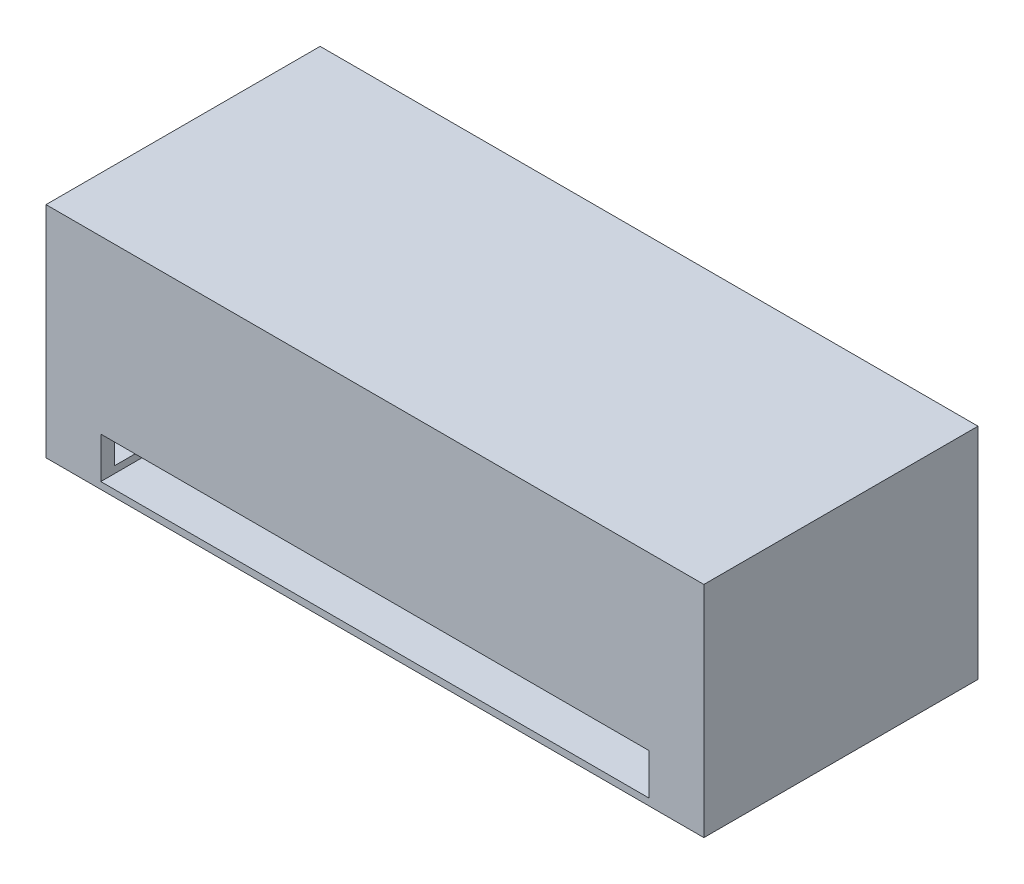
ISO-10303-21;
HEADER;
FILE_DESCRIPTION(('STEP AP214'),'2;1');
FILE_NAME('part.step','',(''),(''),'','','');
FILE_SCHEMA(('AUTOMOTIVE_DESIGN { 1 0 10303 214 1 1 1 1 }'));
ENDSEC;
DATA;
#1=APPLICATION_CONTEXT('core data for automotive mechanical design processes');
#2=APPLICATION_PROTOCOL_DEFINITION('international standard','automotive_design',2000,#1);
#3=PRODUCT_CONTEXT('',#1,'mechanical');
#4=PRODUCT('Part','Part','',(#3));
#5=PRODUCT_RELATED_PRODUCT_CATEGORY('part','',(#4));
#6=PRODUCT_DEFINITION_FORMATION('','',#4);
#7=PRODUCT_DEFINITION_CONTEXT('part definition',#1,'design');
#8=PRODUCT_DEFINITION('design','',#6,#7);
#9=PRODUCT_DEFINITION_SHAPE('','',#8);
#10=(LENGTH_UNIT() NAMED_UNIT(*) SI_UNIT(.MILLI.,.METRE.));
#11=(NAMED_UNIT(*) PLANE_ANGLE_UNIT() SI_UNIT($,.RADIAN.));
#12=(NAMED_UNIT(*) SI_UNIT($,.STERADIAN.) SOLID_ANGLE_UNIT());
#13=UNCERTAINTY_MEASURE_WITH_UNIT(LENGTH_MEASURE(1.E-05),#10,'distance_accuracy_value','');
#14=(GEOMETRIC_REPRESENTATION_CONTEXT(3) GLOBAL_UNCERTAINTY_ASSIGNED_CONTEXT((#13)) GLOBAL_UNIT_ASSIGNED_CONTEXT((#10,
#11,#12)) REPRESENTATION_CONTEXT('',''));
#15=CARTESIAN_POINT('',(0.,0.,0.));
#16=DIRECTION('',(0.,0.,1.));
#17=DIRECTION('',(1.,0.,0.));
#18=AXIS2_PLACEMENT_3D('',#15,#16,#17);
#19=CARTESIAN_POINT('',(0.,6.35,0.));
#20=DIRECTION('',(0.,-1.,0.));
#21=DIRECTION('',(0.,0.,-1.));
#22=AXIS2_PLACEMENT_3D('',#19,#20,#21);
#23=PLANE('',#22);
#24=DIRECTION('',(-1.,0.,0.));
#25=VECTOR('',#24,1.);
#26=CARTESIAN_POINT('',(0.,6.35,-57.15));
#27=LINE('',#26,#25);
#28=CARTESIAN_POINT('',(146.05,6.35,-57.15));
#29=VERTEX_POINT('',#28);
#30=CARTESIAN_POINT('',(127.,6.35,-57.15));
#31=VERTEX_POINT('',#30);
#32=EDGE_CURVE('E256',#29,#31,#27,.T.);
#33=ORIENTED_EDGE('',*,*,#32,.T.);
#34=DIRECTION('',(0.,0.,1.));
#35=VECTOR('',#34,1.);
#36=CARTESIAN_POINT('',(127.,6.35,0.));
#37=LINE('',#36,#35);
#38=CARTESIAN_POINT('',(127.,6.35,57.15));
#39=VERTEX_POINT('',#38);
#40=EDGE_CURVE('E267',#31,#39,#37,.T.);
#41=ORIENTED_EDGE('',*,*,#40,.T.);
#42=DIRECTION('',(1.,0.,0.));
#43=VECTOR('',#42,1.);
#44=CARTESIAN_POINT('',(0.,6.35,57.15));
#45=LINE('',#44,#43);
#46=CARTESIAN_POINT('',(146.05,6.35,57.15));
#47=VERTEX_POINT('',#46);
#48=EDGE_CURVE('E247',#39,#47,#45,.T.);
#49=ORIENTED_EDGE('',*,*,#48,.T.);
#50=DIRECTION('',(0.,0.,-1.));
#51=VECTOR('',#50,1.);
#52=CARTESIAN_POINT('',(146.05,6.35,0.));
#53=LINE('',#52,#51);
#54=EDGE_CURVE('E230',#47,#29,#53,.T.);
#55=ORIENTED_EDGE('',*,*,#54,.T.);
#56=EDGE_LOOP('',(#33,#41,#49,#55));
#57=FACE_BOUND('',#56,.T.);
#58=ADVANCED_FACE('F35',(#57),#23,.F.);
#59=CARTESIAN_POINT('',(146.05,101.6,63.5));
#60=DIRECTION('',(-1.,0.,0.));
#61=DIRECTION('',(0.,0.,1.));
#62=AXIS2_PLACEMENT_3D('',#59,#60,#61);
#63=PLANE('',#62);
#64=ORIENTED_EDGE('',*,*,#54,.F.);
#65=DIRECTION('',(0.,-1.,0.));
#66=VECTOR('',#65,1.);
#67=CARTESIAN_POINT('',(146.05,101.6,57.15));
#68=LINE('',#67,#66);
#69=CARTESIAN_POINT('',(146.05,95.25,57.15));
#70=VERTEX_POINT('',#69);
#71=EDGE_CURVE('E260',#70,#47,#68,.T.);
#72=ORIENTED_EDGE('',*,*,#71,.F.);
#73=DIRECTION('',(0.,0.,-1.));
#74=VECTOR('',#73,1.);
#75=CARTESIAN_POINT('',(146.05,95.25,0.));
#76=LINE('',#75,#74);
#77=CARTESIAN_POINT('',(146.05,95.25,-57.15));
#78=VERTEX_POINT('',#77);
#79=EDGE_CURVE('E238',#70,#78,#76,.T.);
#80=ORIENTED_EDGE('',*,*,#79,.T.);
#81=DIRECTION('',(0.,-1.,0.));
#82=VECTOR('',#81,1.);
#83=CARTESIAN_POINT('',(146.05,101.6,-57.15));
#84=LINE('',#83,#82);
#85=EDGE_CURVE('E253',#78,#29,#84,.T.);
#86=ORIENTED_EDGE('',*,*,#85,.T.);
#87=EDGE_LOOP('',(#64,#72,#80,#86));
#88=FACE_BOUND('',#87,.T.);
#89=ADVANCED_FACE('F311',(#88),#63,.T.);
#90=CARTESIAN_POINT('',(-152.4,101.6,-57.15));
#91=DIRECTION('',(0.,0.,1.));
#92=DIRECTION('',(1.,0.,0.));
#93=AXIS2_PLACEMENT_3D('',#90,#91,#92);
#94=PLANE('',#93);
#95=DIRECTION('',(0.,1.,0.));
#96=VECTOR('',#95,1.);
#97=CARTESIAN_POINT('',(127.,101.6,-57.15));
#98=LINE('',#97,#96);
#99=CARTESIAN_POINT('',(127.,22.225,-57.15));
#100=VERTEX_POINT('',#99);
#101=EDGE_CURVE('E157',#31,#100,#98,.T.);
#102=ORIENTED_EDGE('',*,*,#101,.F.);
#103=ORIENTED_EDGE('',*,*,#32,.F.);
#104=ORIENTED_EDGE('',*,*,#85,.F.);
#105=DIRECTION('',(-1.,0.,0.));
#106=VECTOR('',#105,1.);
#107=CARTESIAN_POINT('',(0.,95.25,-57.15));
#108=LINE('',#107,#106);
#109=CARTESIAN_POINT('',(-146.05,95.25,-57.15));
#110=VERTEX_POINT('',#109);
#111=EDGE_CURVE('E236',#78,#110,#108,.T.);
#112=ORIENTED_EDGE('',*,*,#111,.T.);
#113=DIRECTION('',(0.,-1.,0.));
#114=VECTOR('',#113,1.);
#115=CARTESIAN_POINT('',(-146.05,101.6,-57.15));
#116=LINE('',#115,#114);
#117=CARTESIAN_POINT('',(-146.05,6.35,-57.15));
#118=VERTEX_POINT('',#117);
#119=EDGE_CURVE('E248',#110,#118,#116,.T.);
#120=ORIENTED_EDGE('',*,*,#119,.T.);
#121=CARTESIAN_POINT('',(-127.,6.35,-57.15));
#122=VERTEX_POINT('',#121);
#123=EDGE_CURVE('E259',#122,#118,#27,.T.);
#124=ORIENTED_EDGE('',*,*,#123,.F.);
#125=DIRECTION('',(0.,-1.,0.));
#126=VECTOR('',#125,1.);
#127=CARTESIAN_POINT('',(-127.,101.6,-57.15));
#128=LINE('',#127,#126);
#129=CARTESIAN_POINT('',(-127.,22.225,-57.15));
#130=VERTEX_POINT('',#129);
#131=EDGE_CURVE('E184',#130,#122,#128,.T.);
#132=ORIENTED_EDGE('',*,*,#131,.F.);
#133=DIRECTION('',(-1.,0.,0.));
#134=VECTOR('',#133,1.);
#135=CARTESIAN_POINT('',(-152.4,22.225,-57.15));
#136=LINE('',#135,#134);
#137=EDGE_CURVE('E195',#100,#130,#136,.T.);
#138=ORIENTED_EDGE('',*,*,#137,.F.);
#139=EDGE_LOOP('',(#102,#103,#104,#112,#120,#124,#132,#138));
#140=FACE_BOUND('',#139,.T.);
#141=ADVANCED_FACE('F282',(#140),#94,.T.);
#142=CARTESIAN_POINT('',(-146.05,101.6,63.5));
#143=DIRECTION('',(1.,0.,0.));
#144=DIRECTION('',(0.,0.,-1.));
#145=AXIS2_PLACEMENT_3D('',#142,#143,#144);
#146=PLANE('',#145);
#147=DIRECTION('',(0.,0.,1.));
#148=VECTOR('',#147,1.);
#149=CARTESIAN_POINT('',(-146.05,6.35,0.));
#150=LINE('',#149,#148);
#151=CARTESIAN_POINT('',(-146.05,6.35,57.15));
#152=VERTEX_POINT('',#151);
#153=EDGE_CURVE('E251',#118,#152,#150,.T.);
#154=ORIENTED_EDGE('',*,*,#153,.F.);
#155=ORIENTED_EDGE('',*,*,#119,.F.);
#156=DIRECTION('',(0.,0.,1.));
#157=VECTOR('',#156,1.);
#158=CARTESIAN_POINT('',(-146.05,95.25,0.));
#159=LINE('',#158,#157);
#160=CARTESIAN_POINT('',(-146.05,95.25,57.15));
#161=VERTEX_POINT('',#160);
#162=EDGE_CURVE('E234',#110,#161,#159,.T.);
#163=ORIENTED_EDGE('',*,*,#162,.T.);
#164=DIRECTION('',(0.,-1.,0.));
#165=VECTOR('',#164,1.);
#166=CARTESIAN_POINT('',(-146.05,101.6,57.15));
#167=LINE('',#166,#165);
#168=EDGE_CURVE('E241',#161,#152,#167,.T.);
#169=ORIENTED_EDGE('',*,*,#168,.T.);
#170=EDGE_LOOP('',(#154,#155,#163,#169));
#171=FACE_BOUND('',#170,.T.);
#172=ADVANCED_FACE('F293',(#171),#146,.T.);
#173=CARTESIAN_POINT('',(-152.4,101.6,57.15));
#174=DIRECTION('',(0.,0.,-1.));
#175=DIRECTION('',(-1.,0.,0.));
#176=AXIS2_PLACEMENT_3D('',#173,#174,#175);
#177=PLANE('',#176);
#178=DIRECTION('',(0.,-1.,0.));
#179=VECTOR('',#178,1.);
#180=CARTESIAN_POINT('',(127.,101.6,57.15));
#181=LINE('',#180,#179);
#182=CARTESIAN_POINT('',(127.,22.225,57.15));
#183=VERTEX_POINT('',#182);
#184=EDGE_CURVE('E189',#183,#39,#181,.T.);
#185=ORIENTED_EDGE('',*,*,#184,.F.);
#186=DIRECTION('',(1.,0.,0.));
#187=VECTOR('',#186,1.);
#188=CARTESIAN_POINT('',(-152.4,22.225,57.15));
#189=LINE('',#188,#187);
#190=CARTESIAN_POINT('',(-127.,22.225,57.15));
#191=VERTEX_POINT('',#190);
#192=EDGE_CURVE('E43',#191,#183,#189,.T.);
#193=ORIENTED_EDGE('',*,*,#192,.F.);
#194=DIRECTION('',(0.,1.,0.));
#195=VECTOR('',#194,1.);
#196=CARTESIAN_POINT('',(-127.,101.6,57.15));
#197=LINE('',#196,#195);
#198=CARTESIAN_POINT('',(-127.,6.35,57.15));
#199=VERTEX_POINT('',#198);
#200=EDGE_CURVE('E178',#199,#191,#197,.T.);
#201=ORIENTED_EDGE('',*,*,#200,.F.);
#202=EDGE_CURVE('E244',#152,#199,#45,.T.);
#203=ORIENTED_EDGE('',*,*,#202,.F.);
#204=ORIENTED_EDGE('',*,*,#168,.F.);
#205=DIRECTION('',(1.,0.,0.));
#206=VECTOR('',#205,1.);
#207=CARTESIAN_POINT('',(0.,95.25,57.15));
#208=LINE('',#207,#206);
#209=EDGE_CURVE('E231',#161,#70,#208,.T.);
#210=ORIENTED_EDGE('',*,*,#209,.T.);
#211=ORIENTED_EDGE('',*,*,#71,.T.);
#212=ORIENTED_EDGE('',*,*,#48,.F.);
#213=EDGE_LOOP('',(#185,#193,#201,#203,#204,#210,#211,#212));
#214=FACE_BOUND('',#213,.T.);
#215=ADVANCED_FACE('F277',(#214),#177,.T.);
#216=CARTESIAN_POINT('',(0.,95.25,0.));
#217=DIRECTION('',(0.,-1.,0.));
#218=DIRECTION('',(0.,0.,-1.));
#219=AXIS2_PLACEMENT_3D('',#216,#217,#218);
#220=PLANE('',#219);
#221=ORIENTED_EDGE('',*,*,#79,.F.);
#222=ORIENTED_EDGE('',*,*,#209,.F.);
#223=ORIENTED_EDGE('',*,*,#162,.F.);
#224=ORIENTED_EDGE('',*,*,#111,.F.);
#225=EDGE_LOOP('',(#221,#222,#223,#224));
#226=FACE_BOUND('',#225,.T.);
#227=ADVANCED_FACE('F308',(#226),#220,.T.);
#228=ORIENTED_EDGE('',*,*,#202,.T.);
#229=DIRECTION('',(0.,0.,-1.));
#230=VECTOR('',#229,1.);
#231=CARTESIAN_POINT('',(-127.,6.35,0.));
#232=LINE('',#231,#230);
#233=EDGE_CURVE('E233',#199,#122,#232,.T.);
#234=ORIENTED_EDGE('',*,*,#233,.T.);
#235=ORIENTED_EDGE('',*,*,#123,.T.);
#236=ORIENTED_EDGE('',*,*,#153,.T.);
#237=EDGE_LOOP('',(#228,#234,#235,#236));
#238=FACE_BOUND('',#237,.T.);
#239=ADVANCED_FACE('F37',(#238),#23,.F.);
#240=CARTESIAN_POINT('',(-127.,3.175,-63.5));
#241=DIRECTION('',(0.,-1.,0.));
#242=DIRECTION('',(0.,0.,-1.));
#243=AXIS2_PLACEMENT_3D('',#240,#241,#242);
#244=PLANE('',#243);
#245=DIRECTION('',(0.,0.,1.));
#246=VECTOR('',#245,1.);
#247=CARTESIAN_POINT('',(127.,3.175,-63.5));
#248=LINE('',#247,#246);
#249=CARTESIAN_POINT('',(127.,3.175,-63.5));
#250=VERTEX_POINT('',#249);
#251=CARTESIAN_POINT('',(127.,3.175,63.5));
#252=VERTEX_POINT('',#251);
#253=EDGE_CURVE('E176',#250,#252,#248,.T.);
#254=ORIENTED_EDGE('',*,*,#253,.F.);
#255=DIRECTION('',(1.,0.,0.));
#256=VECTOR('',#255,1.);
#257=CARTESIAN_POINT('',(-127.,3.175,-63.5));
#258=LINE('',#257,#256);
#259=CARTESIAN_POINT('',(-127.,3.175,-63.5));
#260=VERTEX_POINT('',#259);
#261=EDGE_CURVE('E171',#260,#250,#258,.T.);
#262=ORIENTED_EDGE('',*,*,#261,.F.);
#263=DIRECTION('',(0.,0.,1.));
#264=VECTOR('',#263,1.);
#265=CARTESIAN_POINT('',(-127.,3.175,-63.5));
#266=LINE('',#265,#264);
#267=CARTESIAN_POINT('',(-127.,3.175,63.5));
#268=VERTEX_POINT('',#267);
#269=EDGE_CURVE('E179',#260,#268,#266,.T.);
#270=ORIENTED_EDGE('',*,*,#269,.T.);
#271=DIRECTION('',(-1.,0.,0.));
#272=VECTOR('',#271,1.);
#273=CARTESIAN_POINT('',(-152.4,3.175,63.5));
#274=LINE('',#273,#272);
#275=EDGE_CURVE('E11',#252,#268,#274,.T.);
#276=ORIENTED_EDGE('',*,*,#275,.F.);
#277=EDGE_LOOP('',(#254,#262,#270,#276));
#278=FACE_BOUND('',#277,.T.);
#279=ADVANCED_FACE('F300',(#278),#244,.F.);
#280=CARTESIAN_POINT('',(-127.,22.225,-63.5));
#281=DIRECTION('',(0.,1.,0.));
#282=DIRECTION('',(0.,0.,1.));
#283=AXIS2_PLACEMENT_3D('',#280,#281,#282);
#284=PLANE('',#283);
#285=DIRECTION('',(0.,0.,1.));
#286=VECTOR('',#285,1.);
#287=CARTESIAN_POINT('',(-127.,22.225,-63.5));
#288=LINE('',#287,#286);
#289=CARTESIAN_POINT('',(-127.,22.225,63.5));
#290=VERTEX_POINT('',#289);
#291=EDGE_CURVE('E160',#191,#290,#288,.T.);
#292=ORIENTED_EDGE('',*,*,#291,.F.);
#293=ORIENTED_EDGE('',*,*,#192,.T.);
#294=DIRECTION('',(0.,0.,1.));
#295=VECTOR('',#294,1.);
#296=CARTESIAN_POINT('',(127.,22.225,-63.5));
#297=LINE('',#296,#295);
#298=CARTESIAN_POINT('',(127.,22.225,63.5));
#299=VERTEX_POINT('',#298);
#300=EDGE_CURVE('E58',#183,#299,#297,.T.);
#301=ORIENTED_EDGE('',*,*,#300,.T.);
#302=DIRECTION('',(1.,0.,0.));
#303=VECTOR('',#302,1.);
#304=CARTESIAN_POINT('',(-152.4,22.225,63.5));
#305=LINE('',#304,#303);
#306=EDGE_CURVE('E197',#290,#299,#305,.T.);
#307=ORIENTED_EDGE('',*,*,#306,.F.);
#308=EDGE_LOOP('',(#292,#293,#301,#307));
#309=FACE_BOUND('',#308,.T.);
#310=ADVANCED_FACE('F271',(#309),#284,.F.);
#311=ORIENTED_EDGE('',*,*,#137,.T.);
#312=CARTESIAN_POINT('',(-127.,22.225,-63.5));
#313=VERTEX_POINT('',#312);
#314=EDGE_CURVE('E165',#313,#130,#288,.T.);
#315=ORIENTED_EDGE('',*,*,#314,.F.);
#316=DIRECTION('',(-1.,0.,0.));
#317=VECTOR('',#316,1.);
#318=CARTESIAN_POINT('',(-127.,22.225,-63.5));
#319=LINE('',#318,#317);
#320=CARTESIAN_POINT('',(127.,22.225,-63.5));
#321=VERTEX_POINT('',#320);
#322=EDGE_CURVE('E163',#321,#313,#319,.T.);
#323=ORIENTED_EDGE('',*,*,#322,.F.);
#324=EDGE_CURVE('E149',#321,#100,#297,.T.);
#325=ORIENTED_EDGE('',*,*,#324,.T.);
#326=EDGE_LOOP('',(#311,#315,#323,#325));
#327=FACE_BOUND('',#326,.T.);
#328=ADVANCED_FACE('F164',(#327),#284,.F.);
#329=CARTESIAN_POINT('',(127.,3.175,-63.5));
#330=DIRECTION('',(1.,0.,0.));
#331=DIRECTION('',(0.,0.,-1.));
#332=AXIS2_PLACEMENT_3D('',#329,#330,#331);
#333=PLANE('',#332);
#334=ORIENTED_EDGE('',*,*,#300,.F.);
#335=ORIENTED_EDGE('',*,*,#184,.T.);
#336=ORIENTED_EDGE('',*,*,#40,.F.);
#337=ORIENTED_EDGE('',*,*,#101,.T.);
#338=ORIENTED_EDGE('',*,*,#324,.F.);
#339=DIRECTION('',(0.,1.,0.));
#340=VECTOR('',#339,1.);
#341=CARTESIAN_POINT('',(127.,3.175,-63.5));
#342=LINE('',#341,#340);
#343=EDGE_CURVE('E154',#250,#321,#342,.T.);
#344=ORIENTED_EDGE('',*,*,#343,.F.);
#345=ORIENTED_EDGE('',*,*,#253,.T.);
#346=DIRECTION('',(0.,-1.,0.));
#347=VECTOR('',#346,1.);
#348=CARTESIAN_POINT('',(127.,101.6,63.5));
#349=LINE('',#348,#347);
#350=EDGE_CURVE('E192',#299,#252,#349,.T.);
#351=ORIENTED_EDGE('',*,*,#350,.F.);
#352=EDGE_LOOP('',(#334,#335,#336,#337,#338,#344,#345,#351));
#353=FACE_BOUND('',#352,.T.);
#354=ADVANCED_FACE('F151',(#353),#333,.F.);
#355=CARTESIAN_POINT('',(-127.,3.175,-63.5));
#356=DIRECTION('',(-1.,0.,0.));
#357=DIRECTION('',(0.,0.,1.));
#358=AXIS2_PLACEMENT_3D('',#355,#356,#357);
#359=PLANE('',#358);
#360=ORIENTED_EDGE('',*,*,#269,.F.);
#361=DIRECTION('',(0.,-1.,0.));
#362=VECTOR('',#361,1.);
#363=CARTESIAN_POINT('',(-127.,3.175,-63.5));
#364=LINE('',#363,#362);
#365=EDGE_CURVE('E50',#313,#260,#364,.T.);
#366=ORIENTED_EDGE('',*,*,#365,.F.);
#367=ORIENTED_EDGE('',*,*,#314,.T.);
#368=ORIENTED_EDGE('',*,*,#131,.T.);
#369=ORIENTED_EDGE('',*,*,#233,.F.);
#370=ORIENTED_EDGE('',*,*,#200,.T.);
#371=ORIENTED_EDGE('',*,*,#291,.T.);
#372=DIRECTION('',(0.,1.,0.));
#373=VECTOR('',#372,1.);
#374=CARTESIAN_POINT('',(-127.,101.6,63.5));
#375=LINE('',#374,#373);
#376=EDGE_CURVE('E186',#268,#290,#375,.T.);
#377=ORIENTED_EDGE('',*,*,#376,.F.);
#378=EDGE_LOOP('',(#360,#366,#367,#368,#369,#370,#371,#377));
#379=FACE_BOUND('',#378,.T.);
#380=ADVANCED_FACE('F286',(#379),#359,.F.);
#381=CARTESIAN_POINT('',(152.4,101.6,63.5));
#382=DIRECTION('',(-1.,0.,0.));
#383=DIRECTION('',(0.,0.,1.));
#384=AXIS2_PLACEMENT_3D('',#381,#382,#383);
#385=PLANE('',#384);
#386=DIRECTION('',(0.,0.,-1.));
#387=VECTOR('',#386,1.);
#388=CARTESIAN_POINT('',(152.4,0.,63.5));
#389=LINE('',#388,#387);
#390=CARTESIAN_POINT('',(152.4,0.,63.5));
#391=VERTEX_POINT('',#390);
#392=CARTESIAN_POINT('',(152.4,0.,-63.5));
#393=VERTEX_POINT('',#392);
#394=EDGE_CURVE('E200',#391,#393,#389,.T.);
#395=ORIENTED_EDGE('',*,*,#394,.T.);
#396=DIRECTION('',(0.,-1.,0.));
#397=VECTOR('',#396,1.);
#398=CARTESIAN_POINT('',(152.4,101.6,-63.5));
#399=LINE('',#398,#397);
#400=CARTESIAN_POINT('',(152.4,101.6,-63.5));
#401=VERTEX_POINT('',#400);
#402=EDGE_CURVE('E227',#401,#393,#399,.T.);
#403=ORIENTED_EDGE('',*,*,#402,.F.);
#404=DIRECTION('',(0.,0.,-1.));
#405=VECTOR('',#404,1.);
#406=CARTESIAN_POINT('',(152.4,101.6,63.5));
#407=LINE('',#406,#405);
#408=CARTESIAN_POINT('',(152.4,101.6,63.5));
#409=VERTEX_POINT('',#408);
#410=EDGE_CURVE('E201',#409,#401,#407,.T.);
#411=ORIENTED_EDGE('',*,*,#410,.F.);
#412=DIRECTION('',(0.,-1.,0.));
#413=VECTOR('',#412,1.);
#414=CARTESIAN_POINT('',(152.4,101.6,63.5));
#415=LINE('',#414,#413);
#416=EDGE_CURVE('E211',#409,#391,#415,.T.);
#417=ORIENTED_EDGE('',*,*,#416,.T.);
#418=EDGE_LOOP('',(#395,#403,#411,#417));
#419=FACE_BOUND('',#418,.T.);
#420=ADVANCED_FACE('F322',(#419),#385,.F.);
#421=CARTESIAN_POINT('',(-152.4,101.6,-63.5));
#422=DIRECTION('',(0.,0.,1.));
#423=DIRECTION('',(1.,0.,0.));
#424=AXIS2_PLACEMENT_3D('',#421,#422,#423);
#425=PLANE('',#424);
#426=ORIENTED_EDGE('',*,*,#261,.T.);
#427=ORIENTED_EDGE('',*,*,#343,.T.);
#428=ORIENTED_EDGE('',*,*,#322,.T.);
#429=ORIENTED_EDGE('',*,*,#365,.T.);
#430=EDGE_LOOP('',(#426,#427,#428,#429));
#431=FACE_BOUND('',#430,.T.);
#432=DIRECTION('',(-1.,0.,0.));
#433=VECTOR('',#432,1.);
#434=CARTESIAN_POINT('',(-152.4,0.,-63.5));
#435=LINE('',#434,#433);
#436=CARTESIAN_POINT('',(-152.4,0.,-63.5));
#437=VERTEX_POINT('',#436);
#438=EDGE_CURVE('E214',#393,#437,#435,.T.);
#439=ORIENTED_EDGE('',*,*,#438,.T.);
#440=DIRECTION('',(0.,-1.,0.));
#441=VECTOR('',#440,1.);
#442=CARTESIAN_POINT('',(-152.4,101.6,-63.5));
#443=LINE('',#442,#441);
#444=CARTESIAN_POINT('',(-152.4,101.6,-63.5));
#445=VERTEX_POINT('',#444);
#446=EDGE_CURVE('E224',#445,#437,#443,.T.);
#447=ORIENTED_EDGE('',*,*,#446,.F.);
#448=DIRECTION('',(-1.,0.,0.));
#449=VECTOR('',#448,1.);
#450=CARTESIAN_POINT('',(-152.4,101.6,-63.5));
#451=LINE('',#450,#449);
#452=EDGE_CURVE('E204',#401,#445,#451,.T.);
#453=ORIENTED_EDGE('',*,*,#452,.F.);
#454=ORIENTED_EDGE('',*,*,#402,.T.);
#455=EDGE_LOOP('',(#439,#447,#453,#454));
#456=FACE_BOUND('',#455,.T.);
#457=ADVANCED_FACE('F168',(#431,#456),#425,.F.);
#458=CARTESIAN_POINT('',(-152.4,101.6,63.5));
#459=DIRECTION('',(1.,0.,0.));
#460=DIRECTION('',(0.,0.,-1.));
#461=AXIS2_PLACEMENT_3D('',#458,#459,#460);
#462=PLANE('',#461);
#463=DIRECTION('',(0.,0.,1.));
#464=VECTOR('',#463,1.);
#465=CARTESIAN_POINT('',(-152.4,0.,63.5));
#466=LINE('',#465,#464);
#467=CARTESIAN_POINT('',(-152.4,0.,63.5));
#468=VERTEX_POINT('',#467);
#469=EDGE_CURVE('E216',#437,#468,#466,.T.);
#470=ORIENTED_EDGE('',*,*,#469,.T.);
#471=DIRECTION('',(0.,-1.,0.));
#472=VECTOR('',#471,1.);
#473=CARTESIAN_POINT('',(-152.4,101.6,63.5));
#474=LINE('',#473,#472);
#475=CARTESIAN_POINT('',(-152.4,101.6,63.5));
#476=VERTEX_POINT('',#475);
#477=EDGE_CURVE('E221',#476,#468,#474,.T.);
#478=ORIENTED_EDGE('',*,*,#477,.F.);
#479=DIRECTION('',(0.,0.,1.));
#480=VECTOR('',#479,1.);
#481=CARTESIAN_POINT('',(-152.4,101.6,63.5));
#482=LINE('',#481,#480);
#483=EDGE_CURVE('E207',#445,#476,#482,.T.);
#484=ORIENTED_EDGE('',*,*,#483,.F.);
#485=ORIENTED_EDGE('',*,*,#446,.T.);
#486=EDGE_LOOP('',(#470,#478,#484,#485));
#487=FACE_BOUND('',#486,.T.);
#488=ADVANCED_FACE('F386',(#487),#462,.F.);
#489=CARTESIAN_POINT('',(-152.4,101.6,63.5));
#490=DIRECTION('',(0.,0.,-1.));
#491=DIRECTION('',(-1.,0.,0.));
#492=AXIS2_PLACEMENT_3D('',#489,#490,#491);
#493=PLANE('',#492);
#494=ORIENTED_EDGE('',*,*,#306,.T.);
#495=ORIENTED_EDGE('',*,*,#350,.T.);
#496=ORIENTED_EDGE('',*,*,#275,.T.);
#497=ORIENTED_EDGE('',*,*,#376,.T.);
#498=EDGE_LOOP('',(#494,#495,#496,#497));
#499=FACE_BOUND('',#498,.T.);
#500=DIRECTION('',(1.,0.,0.));
#501=VECTOR('',#500,1.);
#502=CARTESIAN_POINT('',(-152.4,0.,63.5));
#503=LINE('',#502,#501);
#504=EDGE_CURVE('E205',#468,#391,#503,.T.);
#505=ORIENTED_EDGE('',*,*,#504,.T.);
#506=ORIENTED_EDGE('',*,*,#416,.F.);
#507=DIRECTION('',(1.,0.,0.));
#508=VECTOR('',#507,1.);
#509=CARTESIAN_POINT('',(-152.4,101.6,63.5));
#510=LINE('',#509,#508);
#511=EDGE_CURVE('E209',#476,#409,#510,.T.);
#512=ORIENTED_EDGE('',*,*,#511,.F.);
#513=ORIENTED_EDGE('',*,*,#477,.T.);
#514=EDGE_LOOP('',(#505,#506,#512,#513));
#515=FACE_BOUND('',#514,.T.);
#516=ADVANCED_FACE('F297',(#499,#515),#493,.F.);
#517=CARTESIAN_POINT('',(0.,101.6,0.));
#518=DIRECTION('',(0.,-1.,0.));
#519=DIRECTION('',(0.,0.,-1.));
#520=AXIS2_PLACEMENT_3D('',#517,#518,#519);
#521=PLANE('',#520);
#522=ORIENTED_EDGE('',*,*,#410,.T.);
#523=ORIENTED_EDGE('',*,*,#452,.T.);
#524=ORIENTED_EDGE('',*,*,#483,.T.);
#525=ORIENTED_EDGE('',*,*,#511,.T.);
#526=EDGE_LOOP('',(#522,#523,#524,#525));
#527=FACE_BOUND('',#526,.T.);
#528=ADVANCED_FACE('F396',(#527),#521,.F.);
#529=CARTESIAN_POINT('',(0.,0.,0.));
#530=DIRECTION('',(0.,-1.,0.));
#531=DIRECTION('',(0.,0.,-1.));
#532=AXIS2_PLACEMENT_3D('',#529,#530,#531);
#533=PLANE('',#532);
#534=ORIENTED_EDGE('',*,*,#394,.F.);
#535=ORIENTED_EDGE('',*,*,#504,.F.);
#536=ORIENTED_EDGE('',*,*,#469,.F.);
#537=ORIENTED_EDGE('',*,*,#438,.F.);
#538=EDGE_LOOP('',(#534,#535,#536,#537));
#539=FACE_BOUND('',#538,.T.);
#540=ADVANCED_FACE('F408',(#539),#533,.T.);
#541=CLOSED_SHELL('',(#58,#89,#141,#172,#215,#227,#239,#279,#310,#328,#354,#380,#420,#457,#488,
#516,#528,#540));
#542=MANIFOLD_SOLID_BREP('B2',#541);
#543=ADVANCED_BREP_SHAPE_REPRESENTATION('',(#18,#542),#14);
#544=SHAPE_DEFINITION_REPRESENTATION(#9,#543);
ENDSEC;
END-ISO-10303-21;
